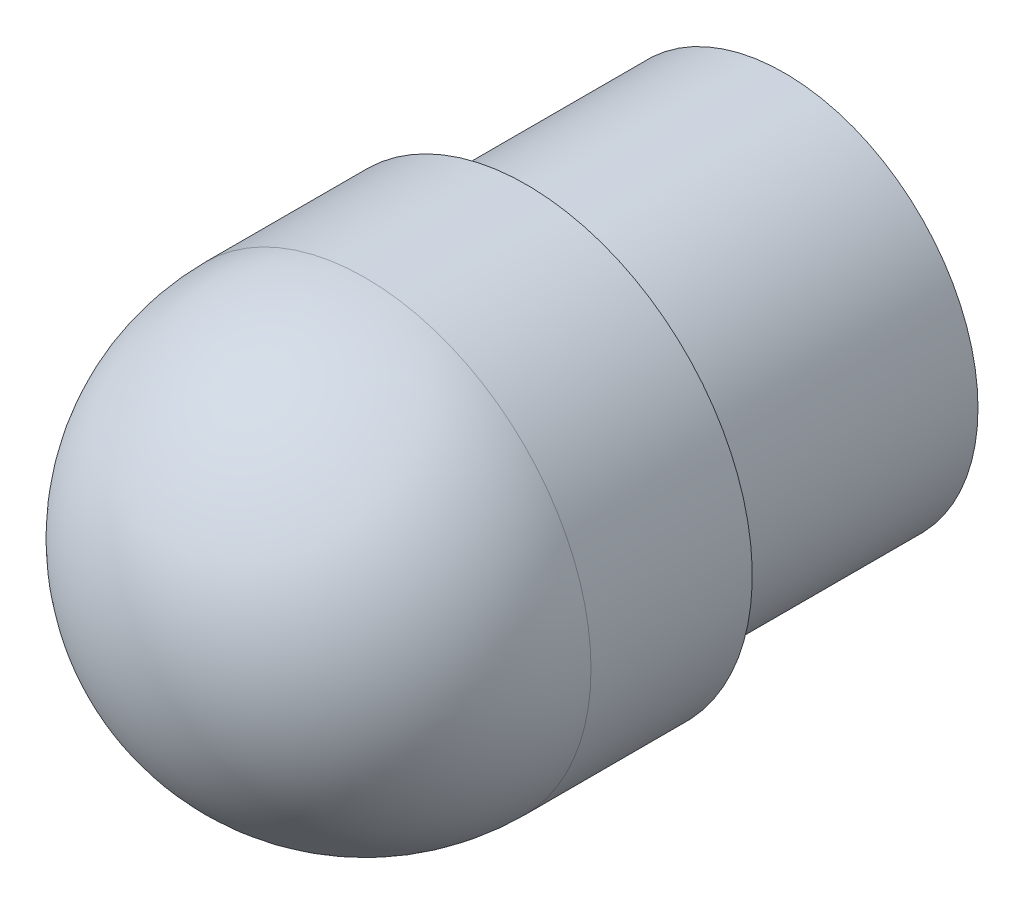
ISO-10303-21;
HEADER;
FILE_DESCRIPTION(('STEP AP214'),'2;1');
FILE_NAME('part.step','',(''),(''),'','','');
FILE_SCHEMA(('AUTOMOTIVE_DESIGN { 1 0 10303 214 1 1 1 1 }'));
ENDSEC;
DATA;
#1=APPLICATION_CONTEXT('core data for automotive mechanical design processes');
#2=APPLICATION_PROTOCOL_DEFINITION('international standard','automotive_design',2000,#1);
#3=PRODUCT_CONTEXT('',#1,'mechanical');
#4=PRODUCT('Part','Part','',(#3));
#5=PRODUCT_RELATED_PRODUCT_CATEGORY('part','',(#4));
#6=PRODUCT_DEFINITION_FORMATION('','',#4);
#7=PRODUCT_DEFINITION_CONTEXT('part definition',#1,'design');
#8=PRODUCT_DEFINITION('design','',#6,#7);
#9=PRODUCT_DEFINITION_SHAPE('','',#8);
#10=(LENGTH_UNIT() NAMED_UNIT(*) SI_UNIT(.MILLI.,.METRE.));
#11=(NAMED_UNIT(*) PLANE_ANGLE_UNIT() SI_UNIT($,.RADIAN.));
#12=(NAMED_UNIT(*) SI_UNIT($,.STERADIAN.) SOLID_ANGLE_UNIT());
#13=UNCERTAINTY_MEASURE_WITH_UNIT(LENGTH_MEASURE(1.E-05),#10,'distance_accuracy_value','');
#14=(GEOMETRIC_REPRESENTATION_CONTEXT(3) GLOBAL_UNCERTAINTY_ASSIGNED_CONTEXT((#13)) GLOBAL_UNIT_ASSIGNED_CONTEXT((#10,
#11,#12)) REPRESENTATION_CONTEXT('',''));
#15=CARTESIAN_POINT('',(0.,0.,0.));
#16=DIRECTION('',(0.,0.,1.));
#17=DIRECTION('',(1.,0.,0.));
#18=AXIS2_PLACEMENT_3D('',#15,#16,#17);
#19=CARTESIAN_POINT('',(0.,0.,508.));
#20=DIRECTION('',(0.,0.,-1.));
#21=DIRECTION('',(-1.,0.,0.));
#22=AXIS2_PLACEMENT_3D('',#19,#20,#21);
#23=CYLINDRICAL_SURFACE('',#22,381.);
#24=CARTESIAN_POINT('',(0.,0.,508.));
#25=DIRECTION('',(0.,0.,1.));
#26=DIRECTION('',(1.,0.,0.));
#27=AXIS2_PLACEMENT_3D('',#24,#25,#26);
#28=CIRCLE('',#27,381.);
#29=CARTESIAN_POINT('',(381.,0.,508.));
#30=VERTEX_POINT('',#29);
#31=EDGE_CURVE('E10',#30,#30,#28,.T.);
#32=ORIENTED_EDGE('',*,*,#31,.F.);
#33=EDGE_LOOP('',(#32));
#34=FACE_BOUND('',#33,.T.);
#35=CARTESIAN_POINT('',(0.,0.,0.));
#36=DIRECTION('',(0.,0.,1.));
#37=DIRECTION('',(1.,0.,0.));
#38=AXIS2_PLACEMENT_3D('',#35,#36,#37);
#39=CIRCLE('',#38,381.);
#40=CARTESIAN_POINT('',(381.,0.,0.));
#41=VERTEX_POINT('',#40);
#42=EDGE_CURVE('E34',#41,#41,#39,.T.);
#43=ORIENTED_EDGE('',*,*,#42,.T.);
#44=EDGE_LOOP('',(#43));
#45=FACE_BOUND('',#44,.T.);
#46=ADVANCED_FACE('F31',(#34,#45),#23,.T.);
#47=CARTESIAN_POINT('',(0.,0.,0.));
#48=DIRECTION('',(0.,0.,1.));
#49=DIRECTION('',(1.,0.,0.));
#50=AXIS2_PLACEMENT_3D('',#47,#48,#49);
#51=PLANE('',#50);
#52=ORIENTED_EDGE('',*,*,#42,.F.);
#53=EDGE_LOOP('',(#52));
#54=FACE_BOUND('',#53,.T.);
#55=ADVANCED_FACE('F55',(#54),#51,.F.);
#56=CARTESIAN_POINT('',(0.,0.,825.5));
#57=DIRECTION('',(0.,0.,-1.));
#58=DIRECTION('',(-1.,0.,0.));
#59=AXIS2_PLACEMENT_3D('',#56,#57,#58);
#60=CYLINDRICAL_SURFACE('',#59,444.5);
#61=CARTESIAN_POINT('',(0.,0.,825.5));
#62=DIRECTION('',(0.,0.,1.));
#63=DIRECTION('',(1.,0.,0.));
#64=AXIS2_PLACEMENT_3D('',#61,#62,#63);
#65=CIRCLE('',#64,444.5);
#66=CARTESIAN_POINT('',(-444.5,0.,825.5));
#67=VERTEX_POINT('',#66);
#68=EDGE_CURVE('E41',#67,#67,#65,.T.);
#69=CARTESIAN_POINT('',(0.,0.,508.));
#70=DIRECTION('',(0.,0.,1.));
#71=DIRECTION('',(1.,0.,0.));
#72=AXIS2_PLACEMENT_3D('',#69,#70,#71);
#73=CIRCLE('',#72,444.5);
#74=CARTESIAN_POINT('',(-444.5,0.,508.));
#75=VERTEX_POINT('',#74);
#76=EDGE_CURVE('E43',#75,#75,#73,.T.);
#77=CARTESIAN_POINT('',(-444.5,0.,825.5));
#78=CARTESIAN_POINT('',(-444.5,0.,822.192708333333));
#79=CARTESIAN_POINT('',(-444.5,0.,818.885416666667));
#80=CARTESIAN_POINT('',(-444.5,0.,812.270833333333));
#81=CARTESIAN_POINT('',(-444.5,0.,808.963541666667));
#82=CARTESIAN_POINT('',(-444.5,0.,802.348958333333));
#83=CARTESIAN_POINT('',(-444.5,0.,799.041666666667));
#84=CARTESIAN_POINT('',(-444.5,0.,792.427083333333));
#85=CARTESIAN_POINT('',(-444.5,0.,789.119791666667));
#86=CARTESIAN_POINT('',(-444.5,0.,782.505208333333));
#87=CARTESIAN_POINT('',(-444.5,0.,779.197916666667));
#88=CARTESIAN_POINT('',(-444.5,0.,772.583333333333));
#89=CARTESIAN_POINT('',(-444.5,0.,769.276041666667));
#90=CARTESIAN_POINT('',(-444.5,0.,762.661458333333));
#91=CARTESIAN_POINT('',(-444.5,0.,759.354166666667));
#92=CARTESIAN_POINT('',(-444.5,0.,752.739583333333));
#93=CARTESIAN_POINT('',(-444.5,0.,749.432291666667));
#94=CARTESIAN_POINT('',(-444.5,0.,742.817708333333));
#95=CARTESIAN_POINT('',(-444.5,0.,739.510416666667));
#96=CARTESIAN_POINT('',(-444.5,0.,732.895833333333));
#97=CARTESIAN_POINT('',(-444.5,0.,729.588541666667));
#98=CARTESIAN_POINT('',(-444.5,0.,722.973958333333));
#99=CARTESIAN_POINT('',(-444.5,0.,719.666666666667));
#100=CARTESIAN_POINT('',(-444.5,0.,713.052083333333));
#101=CARTESIAN_POINT('',(-444.5,0.,709.744791666667));
#102=CARTESIAN_POINT('',(-444.5,0.,703.130208333333));
#103=CARTESIAN_POINT('',(-444.5,0.,699.822916666667));
#104=CARTESIAN_POINT('',(-444.5,0.,693.208333333333));
#105=CARTESIAN_POINT('',(-444.5,0.,689.901041666667));
#106=CARTESIAN_POINT('',(-444.5,0.,683.286458333333));
#107=CARTESIAN_POINT('',(-444.5,0.,679.979166666667));
#108=CARTESIAN_POINT('',(-444.5,0.,673.364583333333));
#109=CARTESIAN_POINT('',(-444.5,0.,670.057291666667));
#110=CARTESIAN_POINT('',(-444.5,0.,663.442708333333));
#111=CARTESIAN_POINT('',(-444.5,0.,660.135416666667));
#112=CARTESIAN_POINT('',(-444.5,0.,653.520833333333));
#113=CARTESIAN_POINT('',(-444.5,0.,650.213541666667));
#114=CARTESIAN_POINT('',(-444.5,0.,643.598958333333));
#115=CARTESIAN_POINT('',(-444.5,0.,640.291666666667));
#116=CARTESIAN_POINT('',(-444.5,0.,633.677083333333));
#117=CARTESIAN_POINT('',(-444.5,0.,630.369791666667));
#118=CARTESIAN_POINT('',(-444.5,0.,623.755208333333));
#119=CARTESIAN_POINT('',(-444.5,0.,620.447916666667));
#120=CARTESIAN_POINT('',(-444.5,0.,613.833333333333));
#121=CARTESIAN_POINT('',(-444.5,0.,610.526041666667));
#122=CARTESIAN_POINT('',(-444.5,0.,603.911458333333));
#123=CARTESIAN_POINT('',(-444.5,0.,600.604166666667));
#124=CARTESIAN_POINT('',(-444.5,0.,593.989583333333));
#125=CARTESIAN_POINT('',(-444.5,0.,590.682291666667));
#126=CARTESIAN_POINT('',(-444.5,0.,584.067708333333));
#127=CARTESIAN_POINT('',(-444.5,0.,580.760416666667));
#128=CARTESIAN_POINT('',(-444.5,0.,574.145833333333));
#129=CARTESIAN_POINT('',(-444.5,0.,570.838541666667));
#130=CARTESIAN_POINT('',(-444.5,0.,564.223958333333));
#131=CARTESIAN_POINT('',(-444.5,0.,560.916666666667));
#132=CARTESIAN_POINT('',(-444.5,0.,554.302083333333));
#133=CARTESIAN_POINT('',(-444.5,0.,550.994791666667));
#134=CARTESIAN_POINT('',(-444.5,0.,544.380208333333));
#135=CARTESIAN_POINT('',(-444.5,0.,541.072916666667));
#136=CARTESIAN_POINT('',(-444.5,0.,534.458333333333));
#137=CARTESIAN_POINT('',(-444.5,0.,531.151041666667));
#138=CARTESIAN_POINT('',(-444.5,0.,524.536458333333));
#139=CARTESIAN_POINT('',(-444.5,0.,521.229166666667));
#140=CARTESIAN_POINT('',(-444.5,0.,514.614583333333));
#141=CARTESIAN_POINT('',(-444.5,0.,511.307291666667));
#142=CARTESIAN_POINT('',(-444.5,0.,508.));
#143=B_SPLINE_CURVE_WITH_KNOTS('',3,(#77,#78,#79,#80,#81,#82,#83,#84,#85,#86,#87,#88,#89,#90,
#91,#92,#93,#94,#95,#96,#97,#98,#99,#100,#101,#102,#103,#104,#105,#106,#107,#108,#109,#110,#111,
#112,#113,#114,#115,#116,#117,#118,#119,#120,#121,#122,#123,#124,#125,#126,#127,#128,#129,#130,
#131,#132,#133,#134,#135,#136,#137,#138,#139,#140,#141,#142),.UNSPECIFIED.,.F.,.F.,(4,2,2,2,2,2,
2,2,2,2,2,2,2,2,2,2,2,2,2,2,2,2,2,2,2,2,2,2,2,2,2,2,4),(0.,9.92187500000008,19.84375,29.765625,
39.6875000000001,49.6093750000001,59.53125,69.453125,79.3750000000001,89.2968750000001,99.21875,
109.140625,119.0625,128.984375,138.90625,148.828125,158.75,168.671875,178.59375,188.515625,
198.4375,208.359375,218.28125,228.203125,238.125,248.046875,257.96875,267.890625,277.8125,
287.734375,297.65625,307.578125,317.5),.UNSPECIFIED.);
#144=EDGE_CURVE('BSEAM51',#67,#75,#143,.T.);
#145=ORIENTED_EDGE('',*,*,#68,.F.);
#146=ORIENTED_EDGE('',*,*,#76,.T.);
#147=ORIENTED_EDGE('',*,*,#144,.T.);
#148=ORIENTED_EDGE('',*,*,#144,.F.);
#149=EDGE_LOOP('',(#145,#147,#146,#148));
#150=FACE_BOUND('',#149,.T.);
#151=ADVANCED_FACE('F51',(#150),#60,.T.);
#152=CARTESIAN_POINT('',(0.,0.,508.));
#153=DIRECTION('',(0.,0.,1.));
#154=DIRECTION('',(1.,0.,0.));
#155=AXIS2_PLACEMENT_3D('',#152,#153,#154);
#156=PLANE('',#155);
#157=ORIENTED_EDGE('',*,*,#31,.T.);
#158=EDGE_LOOP('',(#157));
#159=FACE_BOUND('',#158,.T.);
#160=ORIENTED_EDGE('',*,*,#76,.F.);
#161=EDGE_LOOP('',(#160));
#162=FACE_BOUND('',#161,.T.);
#163=ADVANCED_FACE('F54',(#159,#162),#156,.F.);
#164=CARTESIAN_POINT('',(1.03296744302595E-13,0.,825.5));
#165=DIRECTION('',(0.,1.,0.));
#166=DIRECTION('',(-1.,0.,0.));
#167=AXIS2_PLACEMENT_3D('',#164,#165,#166);
#168=SPHERICAL_SURFACE('',#167,444.5);
#169=CARTESIAN_POINT('',(1.03296744302595E-13,0.,825.5));
#170=DIRECTION('',(0.,0.,1.));
#171=DIRECTION('',(1.,0.,0.));
#172=AXIS2_PLACEMENT_3D('',#169,#170,#171);
#173=SPHERICAL_SURFACE('',#172,444.5);
#174=ORIENTED_EDGE('',*,*,#68,.T.);
#175=EDGE_LOOP('',(#174));
#176=FACE_BOUND('',#175,.T.);
#177=ADVANCED_FACE('F49',(#176),#173,.T.);
#178=CLOSED_SHELL('',(#46,#55,#151,#163,#177));
#179=MANIFOLD_SOLID_BREP('B2',#178);
#180=ADVANCED_BREP_SHAPE_REPRESENTATION('',(#18,#179),#14);
#181=SHAPE_DEFINITION_REPRESENTATION(#9,#180);
ENDSEC;
END-ISO-10303-21;
